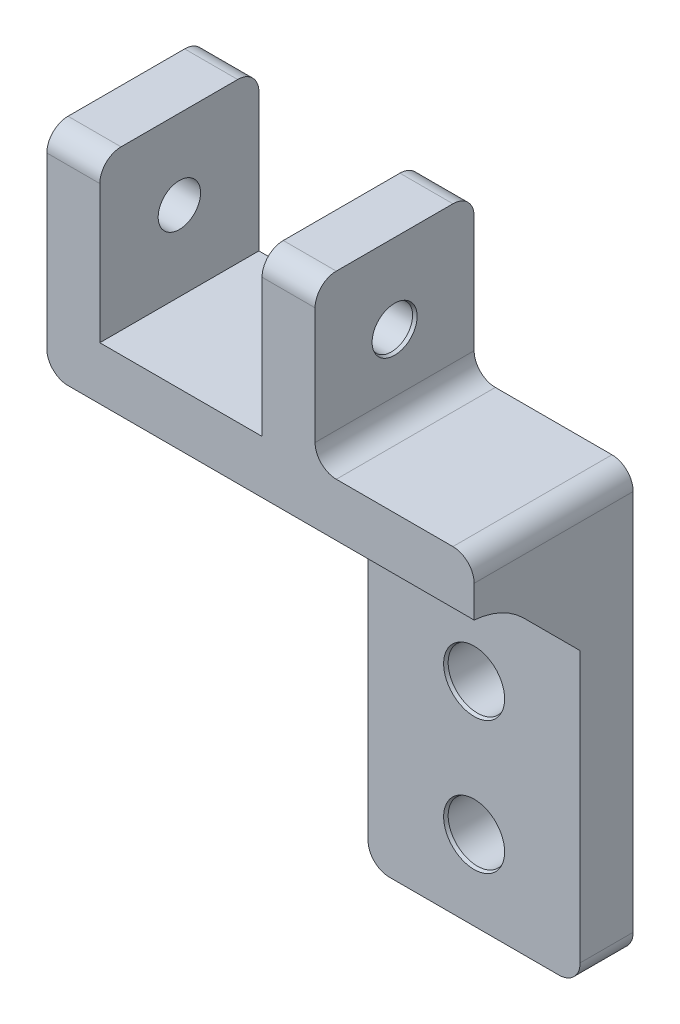
ISO-10303-21;
HEADER;
FILE_DESCRIPTION(('STEP AP214'),'2;1');
FILE_NAME('part.step','',(''),(''),'','','');
FILE_SCHEMA(('AUTOMOTIVE_DESIGN { 1 0 10303 214 1 1 1 1 }'));
ENDSEC;
DATA;
#1=APPLICATION_CONTEXT('core data for automotive mechanical design processes');
#2=APPLICATION_PROTOCOL_DEFINITION('international standard','automotive_design',2000,#1);
#3=PRODUCT_CONTEXT('',#1,'mechanical');
#4=PRODUCT('Part','Part','',(#3));
#5=PRODUCT_RELATED_PRODUCT_CATEGORY('part','',(#4));
#6=PRODUCT_DEFINITION_FORMATION('','',#4);
#7=PRODUCT_DEFINITION_CONTEXT('part definition',#1,'design');
#8=PRODUCT_DEFINITION('design','',#6,#7);
#9=PRODUCT_DEFINITION_SHAPE('','',#8);
#10=(LENGTH_UNIT() NAMED_UNIT(*) SI_UNIT(.MILLI.,.METRE.));
#11=(NAMED_UNIT(*) PLANE_ANGLE_UNIT() SI_UNIT($,.RADIAN.));
#12=(NAMED_UNIT(*) SI_UNIT($,.STERADIAN.) SOLID_ANGLE_UNIT());
#13=UNCERTAINTY_MEASURE_WITH_UNIT(LENGTH_MEASURE(1.E-05),#10,'distance_accuracy_value','');
#14=(GEOMETRIC_REPRESENTATION_CONTEXT(3) GLOBAL_UNCERTAINTY_ASSIGNED_CONTEXT((#13)) GLOBAL_UNIT_ASSIGNED_CONTEXT((#10,
#11,#12)) REPRESENTATION_CONTEXT('',''));
#15=CARTESIAN_POINT('',(0.,0.,0.));
#16=DIRECTION('',(0.,0.,1.));
#17=DIRECTION('',(1.,0.,0.));
#18=AXIS2_PLACEMENT_3D('',#15,#16,#17);
#19=CARTESIAN_POINT('',(5.,35.,0.));
#20=DIRECTION('',(-1.,0.,0.));
#21=DIRECTION('',(0.,0.,1.));
#22=AXIS2_PLACEMENT_3D('',#19,#20,#21);
#23=PLANE('',#22);
#24=DIRECTION('',(0.,-1.,0.));
#25=VECTOR('',#24,1.);
#26=CARTESIAN_POINT('',(5.,35.,10.));
#27=LINE('',#26,#25);
#28=CARTESIAN_POINT('',(5.,33.,10.));
#29=VERTEX_POINT('',#28);
#30=CARTESIAN_POINT('',(5.,22.,10.));
#31=VERTEX_POINT('',#30);
#32=EDGE_CURVE('E234',#29,#31,#27,.T.);
#33=ORIENTED_EDGE('',*,*,#32,.T.);
#34=DIRECTION('',(0.,0.,-1.));
#35=VECTOR('',#34,1.);
#36=CARTESIAN_POINT('',(5.,22.,-4.99999999999999));
#37=LINE('',#36,#35);
#38=CARTESIAN_POINT('',(5.,22.,-4.99999999999999));
#39=VERTEX_POINT('',#38);
#40=EDGE_CURVE('E464',#31,#39,#37,.T.);
#41=ORIENTED_EDGE('',*,*,#40,.T.);
#42=DIRECTION('',(0.,-1.,0.));
#43=VECTOR('',#42,1.);
#44=CARTESIAN_POINT('',(5.,35.,-4.99999999999999));
#45=LINE('',#44,#43);
#46=CARTESIAN_POINT('',(5.,33.,-4.99999999999999));
#47=VERTEX_POINT('',#46);
#48=EDGE_CURVE('E450',#47,#39,#45,.T.);
#49=ORIENTED_EDGE('',*,*,#48,.F.);
#50=CARTESIAN_POINT('',(5.,33.,-2.99999999999999));
#51=DIRECTION('',(-1.,0.,0.));
#52=DIRECTION('',(0.,0.,1.));
#53=AXIS2_PLACEMENT_3D('',#50,#51,#52);
#54=CIRCLE('',#53,2.);
#55=CARTESIAN_POINT('',(5.,35.,-2.99999999999999));
#56=VERTEX_POINT('',#55);
#57=EDGE_CURVE('E559',#47,#56,#54,.F.);
#58=ORIENTED_EDGE('',*,*,#57,.T.);
#59=DIRECTION('',(0.,0.,-1.));
#60=VECTOR('',#59,1.);
#61=CARTESIAN_POINT('',(5.,35.,0.));
#62=LINE('',#61,#60);
#63=CARTESIAN_POINT('',(5.,35.,8.00000000000002));
#64=VERTEX_POINT('',#63);
#65=EDGE_CURVE('E530',#64,#56,#62,.T.);
#66=ORIENTED_EDGE('',*,*,#65,.F.);
#67=CARTESIAN_POINT('',(5.,33.,8.00000000000002));
#68=DIRECTION('',(-1.,0.,0.));
#69=DIRECTION('',(0.,0.,1.));
#70=AXIS2_PLACEMENT_3D('',#67,#68,#69);
#71=CIRCLE('',#70,2.);
#72=EDGE_CURVE('E282',#64,#29,#71,.F.);
#73=ORIENTED_EDGE('',*,*,#72,.T.);
#74=EDGE_LOOP('',(#33,#41,#49,#58,#66,#73));
#75=FACE_BOUND('',#74,.T.);
#76=CARTESIAN_POINT('',(5.00000000000001,27.5,2.50000000000001));
#77=DIRECTION('',(1.,0.,0.));
#78=DIRECTION('',(0.,0.,-1.));
#79=AXIS2_PLACEMENT_3D('',#76,#77,#78);
#80=CIRCLE('',#79,2.125);
#81=CARTESIAN_POINT('',(5.00000000000001,27.5,0.375000000000006));
#82=VERTEX_POINT('',#81);
#83=EDGE_CURVE('E581',#82,#82,#80,.T.);
#84=ORIENTED_EDGE('',*,*,#83,.F.);
#85=EDGE_LOOP('',(#84));
#86=FACE_BOUND('',#85,.T.);
#87=ADVANCED_FACE('F45',(#75,#86),#23,.F.);
#88=CARTESIAN_POINT('',(-20.3,0.,0.));
#89=DIRECTION('',(1.,0.,0.));
#90=DIRECTION('',(0.,0.,-1.));
#91=AXIS2_PLACEMENT_3D('',#88,#89,#90);
#92=PLANE('',#91);
#93=DIRECTION('',(0.,1.,0.));
#94=VECTOR('',#93,1.);
#95=CARTESIAN_POINT('',(-20.3,15.,-4.99999999999999));
#96=LINE('',#95,#94);
#97=CARTESIAN_POINT('',(-20.3,17.,-4.99999999999999));
#98=VERTEX_POINT('',#97);
#99=CARTESIAN_POINT('',(-20.3,33.,-4.99999999999999));
#100=VERTEX_POINT('',#99);
#101=EDGE_CURVE('E484',#98,#100,#96,.T.);
#102=ORIENTED_EDGE('',*,*,#101,.F.);
#103=DIRECTION('',(0.,0.,-1.));
#104=VECTOR('',#103,1.);
#105=CARTESIAN_POINT('',(-20.3,17.,0.));
#106=LINE('',#105,#104);
#107=CARTESIAN_POINT('',(-20.3,17.,10.));
#108=VERTEX_POINT('',#107);
#109=EDGE_CURVE('E417',#98,#108,#106,.F.);
#110=ORIENTED_EDGE('',*,*,#109,.T.);
#111=DIRECTION('',(0.,-1.,0.));
#112=VECTOR('',#111,1.);
#113=CARTESIAN_POINT('',(-20.3,20.,10.));
#114=LINE('',#113,#112);
#115=CARTESIAN_POINT('',(-20.3,33.,10.));
#116=VERTEX_POINT('',#115);
#117=EDGE_CURVE('E223',#116,#108,#114,.T.);
#118=ORIENTED_EDGE('',*,*,#117,.F.);
#119=CARTESIAN_POINT('',(-20.3,33.,8.00000000000002));
#120=DIRECTION('',(1.,0.,0.));
#121=DIRECTION('',(0.,0.,-1.));
#122=AXIS2_PLACEMENT_3D('',#119,#120,#121);
#123=CIRCLE('',#122,2.);
#124=CARTESIAN_POINT('',(-20.3,35.,8.00000000000002));
#125=VERTEX_POINT('',#124);
#126=EDGE_CURVE('E408',#116,#125,#123,.F.);
#127=ORIENTED_EDGE('',*,*,#126,.T.);
#128=DIRECTION('',(0.,0.,1.));
#129=VECTOR('',#128,1.);
#130=CARTESIAN_POINT('',(-20.3,35.,0.));
#131=LINE('',#130,#129);
#132=CARTESIAN_POINT('',(-20.3,35.,-2.99999999999999));
#133=VERTEX_POINT('',#132);
#134=EDGE_CURVE('E544',#133,#125,#131,.T.);
#135=ORIENTED_EDGE('',*,*,#134,.F.);
#136=CARTESIAN_POINT('',(-20.3,33.,-2.99999999999999));
#137=DIRECTION('',(1.,0.,0.));
#138=DIRECTION('',(0.,0.,-1.));
#139=AXIS2_PLACEMENT_3D('',#136,#137,#138);
#140=CIRCLE('',#139,2.);
#141=EDGE_CURVE('E411',#133,#100,#140,.F.);
#142=ORIENTED_EDGE('',*,*,#141,.T.);
#143=EDGE_LOOP('',(#102,#110,#118,#127,#135,#142));
#144=FACE_BOUND('',#143,.T.);
#145=CARTESIAN_POINT('',(-20.3,27.5,2.50000000000001));
#146=DIRECTION('',(-1.,0.,0.));
#147=DIRECTION('',(0.,0.,1.));
#148=AXIS2_PLACEMENT_3D('',#145,#146,#147);
#149=CIRCLE('',#148,2.125);
#150=CARTESIAN_POINT('',(-20.3,27.5,4.62500000000001));
#151=VERTEX_POINT('',#150);
#152=EDGE_CURVE('E574',#151,#151,#149,.T.);
#153=ORIENTED_EDGE('',*,*,#152,.F.);
#154=EDGE_LOOP('',(#153));
#155=FACE_BOUND('',#154,.T.);
#156=ADVANCED_FACE('F355',(#144,#155),#92,.F.);
#157=CARTESIAN_POINT('',(20.,0.,0.));
#158=DIRECTION('',(0.,0.,-1.));
#159=DIRECTION('',(0.,1.,0.));
#160=AXIS2_PLACEMENT_3D('',#157,#158,#159);
#161=PLANE('',#160);
#162=DIRECTION('',(0.,-1.,0.));
#163=VECTOR('',#162,1.);
#164=CARTESIAN_POINT('',(0.,0.,0.));
#165=LINE('',#164,#163);
#166=CARTESIAN_POINT('',(0.,7.49999999999994,0.));
#167=VERTEX_POINT('',#166);
#168=CARTESIAN_POINT('',(0.,-18.,0.));
#169=VERTEX_POINT('',#168);
#170=EDGE_CURVE('E491',#167,#169,#165,.T.);
#171=ORIENTED_EDGE('',*,*,#170,.T.);
#172=CARTESIAN_POINT('',(2.,-18.,0.));
#173=DIRECTION('',(0.,0.,-1.));
#174=DIRECTION('',(0.,1.,0.));
#175=AXIS2_PLACEMENT_3D('',#172,#173,#174);
#176=CIRCLE('',#175,2.);
#177=CARTESIAN_POINT('',(2.,-20.,0.));
#178=VERTEX_POINT('',#177);
#179=EDGE_CURVE('E424',#169,#178,#176,.F.);
#180=ORIENTED_EDGE('',*,*,#179,.T.);
#181=DIRECTION('',(-1.,0.,0.));
#182=VECTOR('',#181,1.);
#183=CARTESIAN_POINT('',(20.,-20.,0.));
#184=LINE('',#183,#182);
#185=CARTESIAN_POINT('',(18.,-20.,0.));
#186=VERTEX_POINT('',#185);
#187=EDGE_CURVE('E252',#186,#178,#184,.T.);
#188=ORIENTED_EDGE('',*,*,#187,.F.);
#189=CARTESIAN_POINT('',(18.,-18.,0.));
#190=DIRECTION('',(0.,0.,-1.));
#191=DIRECTION('',(0.,1.,0.));
#192=AXIS2_PLACEMENT_3D('',#189,#190,#191);
#193=CIRCLE('',#192,2.);
#194=CARTESIAN_POINT('',(20.,-18.,0.));
#195=VERTEX_POINT('',#194);
#196=EDGE_CURVE('E422',#186,#195,#193,.F.);
#197=ORIENTED_EDGE('',*,*,#196,.T.);
#198=DIRECTION('',(0.,-1.,0.));
#199=VECTOR('',#198,1.);
#200=CARTESIAN_POINT('',(20.,0.,0.));
#201=LINE('',#200,#199);
#202=CARTESIAN_POINT('',(20.,7.49999999999994,0.));
#203=VERTEX_POINT('',#202);
#204=EDGE_CURVE('E498',#203,#195,#201,.T.);
#205=ORIENTED_EDGE('',*,*,#204,.F.);
#206=DIRECTION('',(-1.,0.,0.));
#207=VECTOR('',#206,1.);
#208=CARTESIAN_POINT('',(0.,7.49999999999994,0.));
#209=LINE('',#208,#207);
#210=EDGE_CURVE('E259',#203,#167,#209,.T.);
#211=ORIENTED_EDGE('',*,*,#210,.T.);
#212=EDGE_LOOP('',(#171,#180,#188,#197,#205,#211));
#213=FACE_BOUND('',#212,.T.);
#214=CARTESIAN_POINT('',(10.,-12.5,0.));
#215=DIRECTION('',(0.,0.,1.));
#216=DIRECTION('',(1.,0.,0.));
#217=AXIS2_PLACEMENT_3D('',#214,#215,#216);
#218=CIRCLE('',#217,2.875);
#219=CARTESIAN_POINT('',(12.875,-12.5,0.));
#220=VERTEX_POINT('',#219);
#221=EDGE_CURVE('E538',#220,#220,#218,.T.);
#222=ORIENTED_EDGE('',*,*,#221,.F.);
#223=EDGE_LOOP('',(#222));
#224=FACE_BOUND('',#223,.T.);
#225=CARTESIAN_POINT('',(10.,0.,0.));
#226=DIRECTION('',(0.,0.,1.));
#227=DIRECTION('',(1.,0.,0.));
#228=AXIS2_PLACEMENT_3D('',#225,#226,#227);
#229=CIRCLE('',#228,2.875);
#230=CARTESIAN_POINT('',(12.875,0.,0.));
#231=VERTEX_POINT('',#230);
#232=EDGE_CURVE('E590',#231,#231,#229,.T.);
#233=ORIENTED_EDGE('',*,*,#232,.F.);
#234=EDGE_LOOP('',(#233));
#235=FACE_BOUND('',#234,.T.);
#236=ADVANCED_FACE('F362',(#213,#224,#235),#161,.F.);
#237=CARTESIAN_POINT('',(20.,20.,0.));
#238=DIRECTION('',(0.,-1.,0.));
#239=DIRECTION('',(0.,0.,-1.));
#240=AXIS2_PLACEMENT_3D('',#237,#238,#239);
#241=PLANE('',#240);
#242=DIRECTION('',(-1.,0.,0.));
#243=VECTOR('',#242,1.);
#244=CARTESIAN_POINT('',(20.,20.,-4.99999999999999));
#245=LINE('',#244,#243);
#246=CARTESIAN_POINT('',(0.,20.,-4.99999999999999));
#247=VERTEX_POINT('',#246);
#248=CARTESIAN_POINT('',(-15.3,20.,-4.99999999999999));
#249=VERTEX_POINT('',#248);
#250=EDGE_CURVE('E217',#247,#249,#245,.T.);
#251=ORIENTED_EDGE('',*,*,#250,.T.);
#252=DIRECTION('',(0.,0.,1.));
#253=VECTOR('',#252,1.);
#254=CARTESIAN_POINT('',(-15.3,20.,0.));
#255=LINE('',#254,#253);
#256=CARTESIAN_POINT('',(-15.3,20.,10.));
#257=VERTEX_POINT('',#256);
#258=EDGE_CURVE('E227',#249,#257,#255,.T.);
#259=ORIENTED_EDGE('',*,*,#258,.T.);
#260=DIRECTION('',(-1.,0.,0.));
#261=VECTOR('',#260,1.);
#262=CARTESIAN_POINT('',(20.,20.,10.));
#263=LINE('',#262,#261);
#264=CARTESIAN_POINT('',(0.,20.,10.));
#265=VERTEX_POINT('',#264);
#266=EDGE_CURVE('E246',#265,#257,#263,.T.);
#267=ORIENTED_EDGE('',*,*,#266,.F.);
#268=DIRECTION('',(0.,0.,1.));
#269=VECTOR('',#268,1.);
#270=CARTESIAN_POINT('',(0.,20.,0.));
#271=LINE('',#270,#269);
#272=EDGE_CURVE('E239',#247,#265,#271,.T.);
#273=ORIENTED_EDGE('',*,*,#272,.F.);
#274=EDGE_LOOP('',(#251,#259,#267,#273));
#275=FACE_BOUND('',#274,.T.);
#276=ADVANCED_FACE('F237',(#275),#241,.F.);
#277=CARTESIAN_POINT('',(18.,20.,-4.99999999999999));
#278=VERTEX_POINT('',#277);
#279=CARTESIAN_POINT('',(7.,20.,-4.99999999999999));
#280=VERTEX_POINT('',#279);
#281=EDGE_CURVE('E240',#278,#280,#245,.T.);
#282=ORIENTED_EDGE('',*,*,#281,.T.);
#283=DIRECTION('',(0.,0.,-1.));
#284=VECTOR('',#283,1.);
#285=CARTESIAN_POINT('',(7.,20.,10.));
#286=LINE('',#285,#284);
#287=CARTESIAN_POINT('',(7.,20.,10.));
#288=VERTEX_POINT('',#287);
#289=EDGE_CURVE('E456',#280,#288,#286,.F.);
#290=ORIENTED_EDGE('',*,*,#289,.T.);
#291=CARTESIAN_POINT('',(18.,20.,10.));
#292=VERTEX_POINT('',#291);
#293=EDGE_CURVE('E241',#292,#288,#263,.T.);
#294=ORIENTED_EDGE('',*,*,#293,.F.);
#295=DIRECTION('',(0.,0.,1.));
#296=VECTOR('',#295,1.);
#297=CARTESIAN_POINT('',(18.,20.,-4.99999999999999));
#298=LINE('',#297,#296);
#299=EDGE_CURVE('E458',#292,#278,#298,.F.);
#300=ORIENTED_EDGE('',*,*,#299,.T.);
#301=EDGE_LOOP('',(#282,#290,#294,#300));
#302=FACE_BOUND('',#301,.T.);
#303=ADVANCED_FACE('F379',(#302),#241,.F.);
#304=CARTESIAN_POINT('',(20.,0.,9.99999999999999));
#305=DIRECTION('',(0.,0.,-1.));
#306=DIRECTION('',(0.,1.,0.));
#307=AXIS2_PLACEMENT_3D('',#304,#305,#306);
#308=PLANE('',#307);
#309=DIRECTION('',(0.,-1.,0.));
#310=VECTOR('',#309,1.);
#311=CARTESIAN_POINT('',(20.,0.,9.99999999999999));
#312=LINE('',#311,#310);
#313=CARTESIAN_POINT('',(20.,18.,10.));
#314=VERTEX_POINT('',#313);
#315=CARTESIAN_POINT('',(20.,15.,10.));
#316=VERTEX_POINT('',#315);
#317=EDGE_CURVE('E496',#314,#316,#312,.T.);
#318=ORIENTED_EDGE('',*,*,#317,.F.);
#319=CARTESIAN_POINT('',(18.,18.,10.));
#320=DIRECTION('',(0.,0.,-1.));
#321=DIRECTION('',(0.,1.,0.));
#322=AXIS2_PLACEMENT_3D('',#319,#320,#321);
#323=CIRCLE('',#322,2.);
#324=EDGE_CURVE('E475',#314,#292,#323,.F.);
#325=ORIENTED_EDGE('',*,*,#324,.T.);
#326=ORIENTED_EDGE('',*,*,#293,.T.);
#327=CARTESIAN_POINT('',(7.,22.,10.));
#328=DIRECTION('',(0.,0.,-1.));
#329=DIRECTION('',(0.,1.,0.));
#330=AXIS2_PLACEMENT_3D('',#327,#328,#329);
#331=CIRCLE('',#330,2.);
#332=EDGE_CURVE('E11',#288,#31,#331,.T.);
#333=ORIENTED_EDGE('',*,*,#332,.T.);
#334=ORIENTED_EDGE('',*,*,#32,.F.);
#335=DIRECTION('',(1.,0.,0.));
#336=VECTOR('',#335,1.);
#337=CARTESIAN_POINT('',(0.,33.,10.));
#338=LINE('',#337,#336);
#339=CARTESIAN_POINT('',(0.,33.,10.));
#340=VERTEX_POINT('',#339);
#341=EDGE_CURVE('E470',#29,#340,#338,.F.);
#342=ORIENTED_EDGE('',*,*,#341,.T.);
#343=DIRECTION('',(0.,-1.,0.));
#344=VECTOR('',#343,1.);
#345=CARTESIAN_POINT('',(0.,35.,10.));
#346=LINE('',#345,#344);
#347=EDGE_CURVE('E551',#340,#265,#346,.T.);
#348=ORIENTED_EDGE('',*,*,#347,.T.);
#349=ORIENTED_EDGE('',*,*,#266,.T.);
#350=DIRECTION('',(0.,-1.,0.));
#351=VECTOR('',#350,1.);
#352=CARTESIAN_POINT('',(-15.3,35.,10.));
#353=LINE('',#352,#351);
#354=CARTESIAN_POINT('',(-15.3,33.,10.));
#355=VERTEX_POINT('',#354);
#356=EDGE_CURVE('E224',#355,#257,#353,.T.);
#357=ORIENTED_EDGE('',*,*,#356,.F.);
#358=DIRECTION('',(1.,0.,0.));
#359=VECTOR('',#358,1.);
#360=CARTESIAN_POINT('',(-20.3,33.,10.));
#361=LINE('',#360,#359);
#362=EDGE_CURVE('E472',#355,#116,#361,.F.);
#363=ORIENTED_EDGE('',*,*,#362,.T.);
#364=ORIENTED_EDGE('',*,*,#117,.T.);
#365=CARTESIAN_POINT('',(-18.3,17.,10.));
#366=DIRECTION('',(0.,0.,-1.));
#367=DIRECTION('',(0.,1.,0.));
#368=AXIS2_PLACEMENT_3D('',#365,#366,#367);
#369=CIRCLE('',#368,2.);
#370=CARTESIAN_POINT('',(-18.3,15.,10.));
#371=VERTEX_POINT('',#370);
#372=EDGE_CURVE('E406',#108,#371,#369,.F.);
#373=ORIENTED_EDGE('',*,*,#372,.T.);
#374=DIRECTION('',(-1.,0.,0.));
#375=VECTOR('',#374,1.);
#376=CARTESIAN_POINT('',(20.,15.,10.));
#377=LINE('',#376,#375);
#378=CARTESIAN_POINT('',(-7.5,15.,10.));
#379=VERTEX_POINT('',#378);
#380=EDGE_CURVE('E255',#379,#371,#377,.T.);
#381=ORIENTED_EDGE('',*,*,#380,.F.);
#382=EDGE_CURVE('E256',#316,#379,#377,.T.);
#383=ORIENTED_EDGE('',*,*,#382,.F.);
#384=EDGE_LOOP('',(#318,#325,#326,#333,#334,#342,#348,#349,#357,#363,#364,#373,#381,#383));
#385=FACE_BOUND('',#384,.T.);
#386=ADVANCED_FACE('F306',(#385),#308,.F.);
#387=CARTESIAN_POINT('',(20.,15.,0.));
#388=DIRECTION('',(0.,1.,0.));
#389=DIRECTION('',(0.,0.,1.));
#390=AXIS2_PLACEMENT_3D('',#387,#388,#389);
#391=PLANE('',#390);
#392=ORIENTED_EDGE('',*,*,#380,.T.);
#393=DIRECTION('',(0.,0.,-1.));
#394=VECTOR('',#393,1.);
#395=CARTESIAN_POINT('',(-18.3,15.,0.));
#396=LINE('',#395,#394);
#397=CARTESIAN_POINT('',(-18.3,15.,-4.99999999999999));
#398=VERTEX_POINT('',#397);
#399=EDGE_CURVE('E400',#371,#398,#396,.T.);
#400=ORIENTED_EDGE('',*,*,#399,.T.);
#401=DIRECTION('',(1.,0.,0.));
#402=VECTOR('',#401,1.);
#403=CARTESIAN_POINT('',(-20.3,15.,-4.99999999999999));
#404=LINE('',#403,#402);
#405=CARTESIAN_POINT('',(-7.5,15.,-4.99999999999999));
#406=VERTEX_POINT('',#405);
#407=EDGE_CURVE('E485',#398,#406,#404,.T.);
#408=ORIENTED_EDGE('',*,*,#407,.T.);
#409=DIRECTION('',(0.,0.,-1.));
#410=VECTOR('',#409,1.);
#411=CARTESIAN_POINT('',(-7.5,15.,7.49999999999998));
#412=LINE('',#411,#410);
#413=EDGE_CURVE('E267',#406,#379,#412,.F.);
#414=ORIENTED_EDGE('',*,*,#413,.T.);
#415=EDGE_LOOP('',(#392,#400,#408,#414));
#416=FACE_BOUND('',#415,.T.);
#417=ADVANCED_FACE('F386',(#416),#391,.F.);
#418=CARTESIAN_POINT('',(20.,-20.,0.));
#419=DIRECTION('',(0.,-1.,0.));
#420=DIRECTION('',(0.,0.,-1.));
#421=AXIS2_PLACEMENT_3D('',#418,#419,#420);
#422=PLANE('',#421);
#423=ORIENTED_EDGE('',*,*,#187,.T.);
#424=DIRECTION('',(0.,0.,1.));
#425=VECTOR('',#424,1.);
#426=CARTESIAN_POINT('',(2.,-20.,-4.99999999999999));
#427=LINE('',#426,#425);
#428=CARTESIAN_POINT('',(2.,-20.,-4.99999999999999));
#429=VERTEX_POINT('',#428);
#430=EDGE_CURVE('E429',#178,#429,#427,.F.);
#431=ORIENTED_EDGE('',*,*,#430,.T.);
#432=DIRECTION('',(-1.,0.,0.));
#433=VECTOR('',#432,1.);
#434=CARTESIAN_POINT('',(20.,-20.,-4.99999999999999));
#435=LINE('',#434,#433);
#436=CARTESIAN_POINT('',(18.,-20.,-4.99999999999999));
#437=VERTEX_POINT('',#436);
#438=EDGE_CURVE('E244',#437,#429,#435,.T.);
#439=ORIENTED_EDGE('',*,*,#438,.F.);
#440=DIRECTION('',(0.,0.,1.));
#441=VECTOR('',#440,1.);
#442=CARTESIAN_POINT('',(18.,-20.,0.));
#443=LINE('',#442,#441);
#444=EDGE_CURVE('E426',#437,#186,#443,.T.);
#445=ORIENTED_EDGE('',*,*,#444,.T.);
#446=EDGE_LOOP('',(#423,#431,#439,#445));
#447=FACE_BOUND('',#446,.T.);
#448=ADVANCED_FACE('F382',(#447),#422,.T.);
#449=CARTESIAN_POINT('',(20.,0.,-4.99999999999999));
#450=DIRECTION('',(0.,0.,-1.));
#451=DIRECTION('',(-1.,0.,0.));
#452=AXIS2_PLACEMENT_3D('',#449,#450,#451);
#453=PLANE('',#452);
#454=CARTESIAN_POINT('',(10.,0.,-4.99999999999999));
#455=DIRECTION('',(0.,0.,-1.));
#456=DIRECTION('',(-1.,0.,0.));
#457=AXIS2_PLACEMENT_3D('',#454,#455,#456);
#458=CIRCLE('',#457,2.75);
#459=CARTESIAN_POINT('',(7.25,0.,-4.99999999999999));
#460=VERTEX_POINT('',#459);
#461=EDGE_CURVE('E596',#460,#460,#458,.T.);
#462=ORIENTED_EDGE('',*,*,#461,.F.);
#463=EDGE_LOOP('',(#462));
#464=FACE_BOUND('',#463,.T.);
#465=CARTESIAN_POINT('',(10.,-12.5,-4.99999999999999));
#466=DIRECTION('',(0.,0.,-1.));
#467=DIRECTION('',(-1.,0.,0.));
#468=AXIS2_PLACEMENT_3D('',#465,#466,#467);
#469=CIRCLE('',#468,2.75);
#470=CARTESIAN_POINT('',(7.25,-12.5,-4.99999999999999));
#471=VERTEX_POINT('',#470);
#472=EDGE_CURVE('E529',#471,#471,#469,.T.);
#473=ORIENTED_EDGE('',*,*,#472,.F.);
#474=EDGE_LOOP('',(#473));
#475=FACE_BOUND('',#474,.T.);
#476=ORIENTED_EDGE('',*,*,#281,.F.);
#477=CARTESIAN_POINT('',(18.,18.,-4.99999999999999));
#478=DIRECTION('',(0.,0.,-1.));
#479=DIRECTION('',(-1.,0.,0.));
#480=AXIS2_PLACEMENT_3D('',#477,#478,#479);
#481=CIRCLE('',#480,2.);
#482=CARTESIAN_POINT('',(20.,18.,-4.99999999999999));
#483=VERTEX_POINT('',#482);
#484=EDGE_CURVE('E409',#278,#483,#481,.T.);
#485=ORIENTED_EDGE('',*,*,#484,.T.);
#486=DIRECTION('',(0.,-1.,0.));
#487=VECTOR('',#486,1.);
#488=CARTESIAN_POINT('',(20.,0.,-4.99999999999999));
#489=LINE('',#488,#487);
#490=CARTESIAN_POINT('',(20.,-18.,-4.99999999999999));
#491=VERTEX_POINT('',#490);
#492=EDGE_CURVE('E502',#483,#491,#489,.T.);
#493=ORIENTED_EDGE('',*,*,#492,.T.);
#494=CARTESIAN_POINT('',(18.,-18.,-4.99999999999999));
#495=DIRECTION('',(0.,0.,-1.));
#496=DIRECTION('',(-1.,0.,0.));
#497=AXIS2_PLACEMENT_3D('',#494,#495,#496);
#498=CIRCLE('',#497,2.);
#499=EDGE_CURVE('E480',#491,#437,#498,.T.);
#500=ORIENTED_EDGE('',*,*,#499,.T.);
#501=ORIENTED_EDGE('',*,*,#438,.T.);
#502=CARTESIAN_POINT('',(2.,-18.,-4.99999999999999));
#503=DIRECTION('',(0.,0.,-1.));
#504=DIRECTION('',(-1.,0.,0.));
#505=AXIS2_PLACEMENT_3D('',#502,#503,#504);
#506=CIRCLE('',#505,2.);
#507=CARTESIAN_POINT('',(0.,-18.,-4.99999999999999));
#508=VERTEX_POINT('',#507);
#509=EDGE_CURVE('E482',#429,#508,#506,.T.);
#510=ORIENTED_EDGE('',*,*,#509,.T.);
#511=DIRECTION('',(0.,-1.,0.));
#512=VECTOR('',#511,1.);
#513=CARTESIAN_POINT('',(0.,0.,-4.99999999999999));
#514=LINE('',#513,#512);
#515=CARTESIAN_POINT('',(0.,7.5,-4.99999999999999));
#516=VERTEX_POINT('',#515);
#517=EDGE_CURVE('E499',#516,#508,#514,.T.);
#518=ORIENTED_EDGE('',*,*,#517,.F.);
#519=CARTESIAN_POINT('',(-7.5,7.5,-4.99999999999999));
#520=DIRECTION('',(0.,0.,-1.));
#521=DIRECTION('',(-1.,0.,0.));
#522=AXIS2_PLACEMENT_3D('',#519,#520,#521);
#523=CIRCLE('',#522,7.5);
#524=EDGE_CURVE('E271',#516,#406,#523,.F.);
#525=ORIENTED_EDGE('',*,*,#524,.T.);
#526=ORIENTED_EDGE('',*,*,#407,.F.);
#527=CARTESIAN_POINT('',(-18.3,17.,-4.99999999999999));
#528=DIRECTION('',(0.,0.,-1.));
#529=DIRECTION('',(-1.,0.,0.));
#530=AXIS2_PLACEMENT_3D('',#527,#528,#529);
#531=CIRCLE('',#530,2.);
#532=EDGE_CURVE('E407',#398,#98,#531,.T.);
#533=ORIENTED_EDGE('',*,*,#532,.T.);
#534=ORIENTED_EDGE('',*,*,#101,.T.);
#535=DIRECTION('',(-1.,0.,0.));
#536=VECTOR('',#535,1.);
#537=CARTESIAN_POINT('',(20.,33.,-4.99999999999999));
#538=LINE('',#537,#536);
#539=CARTESIAN_POINT('',(-15.3,33.,-4.99999999999999));
#540=VERTEX_POINT('',#539);
#541=EDGE_CURVE('E220',#100,#540,#538,.F.);
#542=ORIENTED_EDGE('',*,*,#541,.T.);
#543=DIRECTION('',(0.,-1.,0.));
#544=VECTOR('',#543,1.);
#545=CARTESIAN_POINT('',(-15.3,35.,-4.99999999999999));
#546=LINE('',#545,#544);
#547=EDGE_CURVE('E211',#540,#249,#546,.T.);
#548=ORIENTED_EDGE('',*,*,#547,.T.);
#549=ORIENTED_EDGE('',*,*,#250,.F.);
#550=DIRECTION('',(0.,-1.,0.));
#551=VECTOR('',#550,1.);
#552=CARTESIAN_POINT('',(0.,35.,-4.99999999999999));
#553=LINE('',#552,#551);
#554=CARTESIAN_POINT('',(0.,33.,-4.99999999999999));
#555=VERTEX_POINT('',#554);
#556=EDGE_CURVE('E554',#555,#247,#553,.T.);
#557=ORIENTED_EDGE('',*,*,#556,.F.);
#558=DIRECTION('',(-1.,0.,0.));
#559=VECTOR('',#558,1.);
#560=CARTESIAN_POINT('',(20.,33.,-4.99999999999999));
#561=LINE('',#560,#559);
#562=EDGE_CURVE('E477',#555,#47,#561,.F.);
#563=ORIENTED_EDGE('',*,*,#562,.T.);
#564=ORIENTED_EDGE('',*,*,#48,.T.);
#565=CARTESIAN_POINT('',(7.,22.,-4.99999999999999));
#566=DIRECTION('',(0.,0.,-1.));
#567=DIRECTION('',(-1.,0.,0.));
#568=AXIS2_PLACEMENT_3D('',#565,#566,#567);
#569=CIRCLE('',#568,2.);
#570=EDGE_CURVE('E53',#39,#280,#569,.F.);
#571=ORIENTED_EDGE('',*,*,#570,.T.);
#572=EDGE_LOOP('',(#476,#485,#493,#500,#501,#510,#518,#525,#526,#533,#534,#542,#548,#549,#557,
#563,#564,#571));
#573=FACE_BOUND('',#572,.T.);
#574=ADVANCED_FACE('F214',(#464,#475,#573),#453,.T.);
#575=CARTESIAN_POINT('',(20.,0.,0.));
#576=DIRECTION('',(1.,0.,0.));
#577=DIRECTION('',(0.,0.,-1.));
#578=AXIS2_PLACEMENT_3D('',#575,#576,#577);
#579=PLANE('',#578);
#580=ORIENTED_EDGE('',*,*,#492,.F.);
#581=DIRECTION('',(0.,0.,1.));
#582=VECTOR('',#581,1.);
#583=CARTESIAN_POINT('',(20.,18.,10.));
#584=LINE('',#583,#582);
#585=EDGE_CURVE('E462',#483,#314,#584,.T.);
#586=ORIENTED_EDGE('',*,*,#585,.T.);
#587=ORIENTED_EDGE('',*,*,#317,.T.);
#588=CARTESIAN_POINT('',(20.,7.52679385772713,10.6333955755254));
#589=DIRECTION('',(1.,0.,0.));
#590=DIRECTION('',(0.,0.,-1.));
#591=AXIS2_PLACEMENT_3D('',#588,#589,#590);
#592=CIRCLE('',#591,7.5);
#593=CARTESIAN_POINT('',(20.,12.8300947166262,5.33009471662622));
#594=VERTEX_POINT('',#593);
#595=EDGE_CURVE('E276',#316,#594,#592,.F.);
#596=ORIENTED_EDGE('',*,*,#595,.T.);
#597=DIRECTION('',(0.,0.707106781186551,0.707106781186544));
#598=VECTOR('',#597,1.);
#599=CARTESIAN_POINT('',(20.,7.49999999999994,0.));
#600=LINE('',#599,#598);
#601=EDGE_CURVE('E262',#594,#203,#600,.F.);
#602=ORIENTED_EDGE('',*,*,#601,.T.);
#603=ORIENTED_EDGE('',*,*,#204,.T.);
#604=DIRECTION('',(0.,0.,1.));
#605=VECTOR('',#604,1.);
#606=CARTESIAN_POINT('',(20.,-18.,0.));
#607=LINE('',#606,#605);
#608=EDGE_CURVE('E460',#195,#491,#607,.F.);
#609=ORIENTED_EDGE('',*,*,#608,.T.);
#610=EDGE_LOOP('',(#580,#586,#587,#596,#602,#603,#609));
#611=FACE_BOUND('',#610,.T.);
#612=ADVANCED_FACE('F370',(#611),#579,.T.);
#613=CARTESIAN_POINT('',(0.,0.,0.));
#614=DIRECTION('',(1.,0.,0.));
#615=DIRECTION('',(0.,0.,-1.));
#616=AXIS2_PLACEMENT_3D('',#613,#614,#615);
#617=PLANE('',#616);
#618=ORIENTED_EDGE('',*,*,#517,.T.);
#619=DIRECTION('',(0.,0.,1.));
#620=VECTOR('',#619,1.);
#621=CARTESIAN_POINT('',(0.,-18.,0.));
#622=LINE('',#621,#620);
#623=EDGE_CURVE('E419',#508,#169,#622,.T.);
#624=ORIENTED_EDGE('',*,*,#623,.T.);
#625=ORIENTED_EDGE('',*,*,#170,.F.);
#626=DIRECTION('',(0.,0.,-1.));
#627=VECTOR('',#626,1.);
#628=CARTESIAN_POINT('',(0.,7.5,-4.99999999999999));
#629=LINE('',#628,#627);
#630=EDGE_CURVE('E264',#167,#516,#629,.T.);
#631=ORIENTED_EDGE('',*,*,#630,.T.);
#632=EDGE_LOOP('',(#618,#624,#625,#631));
#633=FACE_BOUND('',#632,.T.);
#634=ADVANCED_FACE('F304',(#633),#617,.F.);
#635=CARTESIAN_POINT('',(20.,7.49999999999994,0.));
#636=DIRECTION('',(0.,-0.707106781186544,0.707106781186551));
#637=DIRECTION('',(1.,0.,0.));
#638=AXIS2_PLACEMENT_3D('',#635,#636,#637);
#639=PLANE('',#638);
#640=ORIENTED_EDGE('',*,*,#601,.F.);
#641=DIRECTION('',(1.,0.,0.));
#642=VECTOR('',#641,1.);
#643=CARTESIAN_POINT('',(20.,12.8300947166262,5.33009471662622));
#644=LINE('',#643,#642);
#645=CARTESIAN_POINT('',(0.,12.8300947166262,5.33009471662622));
#646=VERTEX_POINT('',#645);
#647=EDGE_CURVE('E269',#594,#646,#644,.F.);
#648=ORIENTED_EDGE('',*,*,#647,.T.);
#649=CARTESIAN_POINT('',(0.,12.8300947166262,5.33009471662621));
#650=CARTESIAN_POINT('',(-2.22362905854854,12.8300947166262,5.33009471662621));
#651=B_SPLINE_CURVE_WITH_KNOTS('',1,(#649,#650),.UNSPECIFIED.,.F.,.F.,(2,2),(0.,1.),.UNSPECIFIED.);
#652=CARTESIAN_POINT('',(-2.22362905854854,12.8300947166262,5.33009471662622));
#653=VERTEX_POINT('',#652);
#654=EDGE_CURVE('E278',#646,#653,#651,.T.);
#655=ORIENTED_EDGE('',*,*,#654,.T.);
#656=CARTESIAN_POINT('',(-7.5,7.5,0.));
#657=DIRECTION('',(0.,-0.707106781186544,0.707106781186551));
#658=DIRECTION('',(0.,0.707106781186551,0.707106781186544));
#659=AXIS2_PLACEMENT_3D('',#656,#657,#658);
#660=ELLIPSE('',#659,10.6066017177982,7.5);
#661=EDGE_CURVE('E274',#653,#167,#660,.F.);
#662=ORIENTED_EDGE('',*,*,#661,.T.);
#663=ORIENTED_EDGE('',*,*,#210,.F.);
#664=EDGE_LOOP('',(#640,#648,#655,#662,#663));
#665=FACE_BOUND('',#664,.T.);
#666=ADVANCED_FACE('F292',(#665),#639,.T.);
#667=CARTESIAN_POINT('',(0.,35.,0.));
#668=DIRECTION('',(1.,0.,0.));
#669=DIRECTION('',(0.,0.,-1.));
#670=AXIS2_PLACEMENT_3D('',#667,#668,#669);
#671=PLANE('',#670);
#672=CARTESIAN_POINT('',(0.,27.5,2.50000000000001));
#673=DIRECTION('',(1.,0.,0.));
#674=DIRECTION('',(0.,0.,-1.));
#675=AXIS2_PLACEMENT_3D('',#672,#673,#674);
#676=CIRCLE('',#675,2.);
#677=CARTESIAN_POINT('',(0.,27.5,0.500000000000009));
#678=VERTEX_POINT('',#677);
#679=EDGE_CURVE('E572',#678,#678,#676,.T.);
#680=ORIENTED_EDGE('',*,*,#679,.T.);
#681=EDGE_LOOP('',(#680));
#682=FACE_BOUND('',#681,.T.);
#683=DIRECTION('',(0.,0.,1.));
#684=VECTOR('',#683,1.);
#685=CARTESIAN_POINT('',(0.,35.,0.));
#686=LINE('',#685,#684);
#687=CARTESIAN_POINT('',(0.,35.,-2.99999999999999));
#688=VERTEX_POINT('',#687);
#689=CARTESIAN_POINT('',(0.,35.,8.00000000000002));
#690=VERTEX_POINT('',#689);
#691=EDGE_CURVE('E550',#688,#690,#686,.T.);
#692=ORIENTED_EDGE('',*,*,#691,.F.);
#693=CARTESIAN_POINT('',(0.,33.,-2.99999999999999));
#694=DIRECTION('',(1.,0.,0.));
#695=DIRECTION('',(0.,0.,-1.));
#696=AXIS2_PLACEMENT_3D('',#693,#694,#695);
#697=CIRCLE('',#696,2.);
#698=EDGE_CURVE('E68',#688,#555,#697,.F.);
#699=ORIENTED_EDGE('',*,*,#698,.T.);
#700=ORIENTED_EDGE('',*,*,#556,.T.);
#701=ORIENTED_EDGE('',*,*,#272,.T.);
#702=ORIENTED_EDGE('',*,*,#347,.F.);
#703=CARTESIAN_POINT('',(0.,33.,8.00000000000002));
#704=DIRECTION('',(1.,0.,0.));
#705=DIRECTION('',(0.,0.,-1.));
#706=AXIS2_PLACEMENT_3D('',#703,#704,#705);
#707=CIRCLE('',#706,2.);
#708=EDGE_CURVE('E60',#340,#690,#707,.F.);
#709=ORIENTED_EDGE('',*,*,#708,.T.);
#710=EDGE_LOOP('',(#692,#699,#700,#701,#702,#709));
#711=FACE_BOUND('',#710,.T.);
#712=ADVANCED_FACE('F303',(#682,#711),#671,.F.);
#713=CARTESIAN_POINT('',(0.,35.,0.));
#714=DIRECTION('',(0.,1.,0.));
#715=DIRECTION('',(0.,0.,1.));
#716=AXIS2_PLACEMENT_3D('',#713,#714,#715);
#717=PLANE('',#716);
#718=ORIENTED_EDGE('',*,*,#65,.T.);
#719=DIRECTION('',(-1.,0.,0.));
#720=VECTOR('',#719,1.);
#721=CARTESIAN_POINT('',(0.,35.,-2.99999999999999));
#722=LINE('',#721,#720);
#723=EDGE_CURVE('E444',#56,#688,#722,.T.);
#724=ORIENTED_EDGE('',*,*,#723,.T.);
#725=ORIENTED_EDGE('',*,*,#691,.T.);
#726=DIRECTION('',(1.,0.,0.));
#727=VECTOR('',#726,1.);
#728=CARTESIAN_POINT('',(5.,35.,8.00000000000002));
#729=LINE('',#728,#727);
#730=EDGE_CURVE('E441',#690,#64,#729,.T.);
#731=ORIENTED_EDGE('',*,*,#730,.T.);
#732=EDGE_LOOP('',(#718,#724,#725,#731));
#733=FACE_BOUND('',#732,.T.);
#734=ADVANCED_FACE('F562',(#733),#717,.T.);
#735=CARTESIAN_POINT('',(-15.3,35.,0.));
#736=DIRECTION('',(1.,0.,0.));
#737=DIRECTION('',(0.,0.,-1.));
#738=AXIS2_PLACEMENT_3D('',#735,#736,#737);
#739=PLANE('',#738);
#740=CARTESIAN_POINT('',(-15.3,27.5,2.50000000000001));
#741=DIRECTION('',(1.,0.,0.));
#742=DIRECTION('',(0.,0.,-1.));
#743=AXIS2_PLACEMENT_3D('',#740,#741,#742);
#744=CIRCLE('',#743,2.);
#745=CARTESIAN_POINT('',(-15.3,27.5,0.500000000000009));
#746=VERTEX_POINT('',#745);
#747=EDGE_CURVE('E587',#746,#746,#744,.T.);
#748=ORIENTED_EDGE('',*,*,#747,.F.);
#749=EDGE_LOOP('',(#748));
#750=FACE_BOUND('',#749,.T.);
#751=ORIENTED_EDGE('',*,*,#547,.F.);
#752=CARTESIAN_POINT('',(-15.3,33.,-2.99999999999999));
#753=DIRECTION('',(1.,0.,0.));
#754=DIRECTION('',(0.,0.,-1.));
#755=AXIS2_PLACEMENT_3D('',#752,#753,#754);
#756=CIRCLE('',#755,2.);
#757=CARTESIAN_POINT('',(-15.3,35.,-2.99999999999999));
#758=VERTEX_POINT('',#757);
#759=EDGE_CURVE('E439',#540,#758,#756,.T.);
#760=ORIENTED_EDGE('',*,*,#759,.T.);
#761=DIRECTION('',(0.,0.,1.));
#762=VECTOR('',#761,1.);
#763=CARTESIAN_POINT('',(-15.3,35.,0.));
#764=LINE('',#763,#762);
#765=CARTESIAN_POINT('',(-15.3,35.,8.00000000000002));
#766=VERTEX_POINT('',#765);
#767=EDGE_CURVE('E233',#758,#766,#764,.T.);
#768=ORIENTED_EDGE('',*,*,#767,.T.);
#769=CARTESIAN_POINT('',(-15.3,33.,8.00000000000002));
#770=DIRECTION('',(1.,0.,0.));
#771=DIRECTION('',(0.,0.,-1.));
#772=AXIS2_PLACEMENT_3D('',#769,#770,#771);
#773=CIRCLE('',#772,2.);
#774=EDGE_CURVE('E437',#766,#355,#773,.T.);
#775=ORIENTED_EDGE('',*,*,#774,.T.);
#776=ORIENTED_EDGE('',*,*,#356,.T.);
#777=ORIENTED_EDGE('',*,*,#258,.F.);
#778=EDGE_LOOP('',(#751,#760,#768,#775,#776,#777));
#779=FACE_BOUND('',#778,.T.);
#780=ADVANCED_FACE('F228',(#750,#779),#739,.T.);
#781=CARTESIAN_POINT('',(0.,35.,0.));
#782=DIRECTION('',(0.,1.,0.));
#783=DIRECTION('',(0.,0.,1.));
#784=AXIS2_PLACEMENT_3D('',#781,#782,#783);
#785=PLANE('',#784);
#786=ORIENTED_EDGE('',*,*,#767,.F.);
#787=DIRECTION('',(-1.,0.,0.));
#788=VECTOR('',#787,1.);
#789=CARTESIAN_POINT('',(0.,35.,-2.99999999999999));
#790=LINE('',#789,#788);
#791=EDGE_CURVE('E434',#758,#133,#790,.T.);
#792=ORIENTED_EDGE('',*,*,#791,.T.);
#793=ORIENTED_EDGE('',*,*,#134,.T.);
#794=DIRECTION('',(1.,0.,0.));
#795=VECTOR('',#794,1.);
#796=CARTESIAN_POINT('',(-15.3,35.,8.00000000000002));
#797=LINE('',#796,#795);
#798=EDGE_CURVE('E431',#125,#766,#797,.T.);
#799=ORIENTED_EDGE('',*,*,#798,.T.);
#800=EDGE_LOOP('',(#786,#792,#793,#799));
#801=FACE_BOUND('',#800,.T.);
#802=ADVANCED_FACE('F312',(#801),#785,.T.);
#803=CARTESIAN_POINT('',(20.,7.52679385772713,10.6333955755254));
#804=DIRECTION('',(-1.,0.,0.));
#805=DIRECTION('',(0.,0.,1.));
#806=AXIS2_PLACEMENT_3D('',#803,#804,#805);
#807=CYLINDRICAL_SURFACE('',#806,7.5);
#808=ORIENTED_EDGE('',*,*,#595,.F.);
#809=ORIENTED_EDGE('',*,*,#382,.T.);
#810=CARTESIAN_POINT('',(-7.5,15.,10.));
#811=CARTESIAN_POINT('',(-7.45064003588759,15.0000107973634,10.0002495897014));
#812=CARTESIAN_POINT('',(-7.40191431793143,14.9995135715638,9.99421820981718));
#813=CARTESIAN_POINT('',(-7.30773085253212,14.997676100823,9.97305027310254));
#814=CARTESIAN_POINT('',(-7.26222110005871,14.9963580826153,9.9581542257652));
#815=CARTESIAN_POINT('',(-7.16757871367298,14.9928020049232,9.91986796509792));
#816=CARTESIAN_POINT('',(-7.1188440141531,14.9904601868661,9.89557437359284));
#817=CARTESIAN_POINT('',(-7.0238886615845,14.9850228661308,9.84247886455101));
#818=CARTESIAN_POINT('',(-6.9776737473791,14.9819257242934,9.81366719135174));
#819=CARTESIAN_POINT('',(-6.83969897276582,14.9714586993156,9.72193747768542));
#820=CARTESIAN_POINT('',(-6.75084723102007,14.963007456072,9.65485912631661));
#821=CARTESIAN_POINT('',(-6.56527685165301,14.9421824151855,9.50717021184786));
#822=CARTESIAN_POINT('',(-6.46910880927052,14.9294337811206,9.42595340847993));
#823=CARTESIAN_POINT('',(-6.2794431014943,14.9006363972045,9.26099936987607));
#824=CARTESIAN_POINT('',(-6.18594586802747,14.884587116971,9.17726173141432));
#825=CARTESIAN_POINT('',(-5.90765733176657,14.8314545878726,8.92411472131069));
#826=CARTESIAN_POINT('',(-5.72534777309644,14.7894189033355,8.75300941391974));
#827=CARTESIAN_POINT('',(-5.36697986497867,14.6926426083875,8.412666549006));
#828=CARTESIAN_POINT('',(-5.19087136092459,14.6380715841215,8.24343313203368));
#829=CARTESIAN_POINT('',(-4.84219900991675,14.5157127174268,7.90628304818107));
#830=CARTESIAN_POINT('',(-4.66963334343007,14.4479318570339,7.73836573423588));
#831=CARTESIAN_POINT('',(-4.29779889231543,14.285575170016,7.37530733493147));
#832=CARTESIAN_POINT('',(-4.09922168766388,14.1883791956979,7.18061930794135));
#833=CARTESIAN_POINT('',(-3.70790570764852,13.9745453916726,6.79609044583648));
#834=CARTESIAN_POINT('',(-3.5151669853995,13.8579073851569,6.60624965482128));
#835=CARTESIAN_POINT('',(-3.13379982861518,13.6024399949519,6.23010101915647));
#836=CARTESIAN_POINT('',(-2.94528205181498,13.4632934851597,6.0438941447393));
#837=CARTESIAN_POINT('',(-2.66926848393423,13.2383044954665,5.77103384811189));
#838=CARTESIAN_POINT('',(-2.5783475349301,13.1605538314359,5.68111222886496));
#839=CARTESIAN_POINT('',(-2.39902827484833,12.999509086715,5.50370448421718));
#840=CARTESIAN_POINT('',(-2.31063047190959,12.9162139005065,5.41621884948732));
#841=CARTESIAN_POINT('',(-2.22362905854855,12.8300947166262,5.3300947166262));
#842=B_SPLINE_CURVE_WITH_KNOTS('',3,(#810,#811,#812,#813,#814,#815,#816,#817,#818,#819,#820,
#821,#822,#823,#824,#825,#826,#827,#828,#829,#830,#831,#832,#833,#834,#835,#836,#837,#838,#839,
#840,#841),.UNSPECIFIED.,.F.,.F.,(4,2,2,2,2,2,2,2,2,2,2,2,2,2,2,4),(0.,0.146734991609239,
0.289659583362395,0.452798188602042,0.6162940282137,0.950754243188999,1.33022734777384,
1.70976147777259,2.46993142199322,3.22036700060843,3.97040700828396,4.85345935504618,
5.73651973284476,6.63332376154336,7.08217323801467,7.53111247990461),.UNSPECIFIED.);
#843=EDGE_CURVE('E283',#653,#379,#842,.F.);
#844=ORIENTED_EDGE('',*,*,#843,.F.);
#845=ORIENTED_EDGE('',*,*,#654,.F.);
#846=ORIENTED_EDGE('',*,*,#647,.F.);
#847=EDGE_LOOP('',(#808,#809,#844,#845,#846));
#848=FACE_BOUND('',#847,.T.);
#849=ADVANCED_FACE('F308',(#848),#807,.F.);
#850=CARTESIAN_POINT('',(-7.5,7.5,0.));
#851=DIRECTION('',(0.,0.,1.));
#852=DIRECTION('',(1.,0.,0.));
#853=AXIS2_PLACEMENT_3D('',#850,#851,#852);
#854=CYLINDRICAL_SURFACE('',#853,7.5);
#855=ORIENTED_EDGE('',*,*,#843,.T.);
#856=ORIENTED_EDGE('',*,*,#413,.F.);
#857=ORIENTED_EDGE('',*,*,#524,.F.);
#858=ORIENTED_EDGE('',*,*,#630,.F.);
#859=ORIENTED_EDGE('',*,*,#661,.F.);
#860=EDGE_LOOP('',(#855,#856,#857,#858,#859));
#861=FACE_BOUND('',#860,.T.);
#862=ADVANCED_FACE('F311',(#861),#854,.F.);
#863=CARTESIAN_POINT('',(10.,-12.5,0.));
#864=DIRECTION('',(0.,0.,1.));
#865=DIRECTION('',(1.,0.,0.));
#866=AXIS2_PLACEMENT_3D('',#863,#864,#865);
#867=CYLINDRICAL_SURFACE('',#866,2.75);
#868=CARTESIAN_POINT('',(10.,-12.5,-0.30177669529664));
#869=DIRECTION('',(0.,0.,1.));
#870=DIRECTION('',(1.,0.,0.));
#871=AXIS2_PLACEMENT_3D('',#868,#869,#870);
#872=CIRCLE('',#871,2.75);
#873=CARTESIAN_POINT('',(12.75,-12.5,-0.30177669529664));
#874=VERTEX_POINT('',#873);
#875=EDGE_CURVE('E533',#874,#874,#872,.T.);
#876=ORIENTED_EDGE('',*,*,#875,.T.);
#877=EDGE_LOOP('',(#876));
#878=FACE_BOUND('',#877,.T.);
#879=ORIENTED_EDGE('',*,*,#472,.T.);
#880=EDGE_LOOP('',(#879));
#881=FACE_BOUND('',#880,.T.);
#882=ADVANCED_FACE('F317',(#878,#881),#867,.F.);
#883=CARTESIAN_POINT('',(10.,-12.5,0.));
#884=DIRECTION('',(0.,0.,1.));
#885=DIRECTION('',(1.,0.,0.));
#886=AXIS2_PLACEMENT_3D('',#883,#884,#885);
#887=CONICAL_SURFACE('',#886,2.875,0.392699081698726);
#888=ORIENTED_EDGE('',*,*,#875,.F.);
#889=EDGE_LOOP('',(#888));
#890=FACE_BOUND('',#889,.T.);
#891=ORIENTED_EDGE('',*,*,#221,.T.);
#892=EDGE_LOOP('',(#891));
#893=FACE_BOUND('',#892,.T.);
#894=ADVANCED_FACE('F601',(#890,#893),#887,.F.);
#895=CARTESIAN_POINT('',(10.,0.,0.));
#896=DIRECTION('',(0.,0.,1.));
#897=DIRECTION('',(1.,0.,0.));
#898=AXIS2_PLACEMENT_3D('',#895,#896,#897);
#899=CYLINDRICAL_SURFACE('',#898,2.75);
#900=CARTESIAN_POINT('',(10.,0.,-0.30177669529664));
#901=DIRECTION('',(0.,0.,1.));
#902=DIRECTION('',(1.,0.,0.));
#903=AXIS2_PLACEMENT_3D('',#900,#901,#902);
#904=CIRCLE('',#903,2.75);
#905=CARTESIAN_POINT('',(12.75,0.,-0.30177669529664));
#906=VERTEX_POINT('',#905);
#907=EDGE_CURVE('E593',#906,#906,#904,.T.);
#908=ORIENTED_EDGE('',*,*,#907,.T.);
#909=EDGE_LOOP('',(#908));
#910=FACE_BOUND('',#909,.T.);
#911=ORIENTED_EDGE('',*,*,#461,.T.);
#912=EDGE_LOOP('',(#911));
#913=FACE_BOUND('',#912,.T.);
#914=ADVANCED_FACE('F608',(#910,#913),#899,.F.);
#915=CARTESIAN_POINT('',(10.,0.,0.));
#916=DIRECTION('',(0.,0.,1.));
#917=DIRECTION('',(1.,0.,0.));
#918=AXIS2_PLACEMENT_3D('',#915,#916,#917);
#919=CONICAL_SURFACE('',#918,2.875,0.392699081698726);
#920=ORIENTED_EDGE('',*,*,#907,.F.);
#921=EDGE_LOOP('',(#920));
#922=FACE_BOUND('',#921,.T.);
#923=ORIENTED_EDGE('',*,*,#232,.T.);
#924=EDGE_LOOP('',(#923));
#925=FACE_BOUND('',#924,.T.);
#926=ADVANCED_FACE('F605',(#922,#925),#919,.F.);
#927=CARTESIAN_POINT('',(-20.3,27.5,2.50000000000001));
#928=DIRECTION('',(-1.,0.,0.));
#929=DIRECTION('',(0.,0.,1.));
#930=AXIS2_PLACEMENT_3D('',#927,#928,#929);
#931=CYLINDRICAL_SURFACE('',#930,2.);
#932=CARTESIAN_POINT('',(-19.9982233047034,27.5,2.50000000000001));
#933=DIRECTION('',(-1.,0.,0.));
#934=DIRECTION('',(0.,0.,1.));
#935=AXIS2_PLACEMENT_3D('',#932,#933,#934);
#936=CIRCLE('',#935,2.);
#937=CARTESIAN_POINT('',(-19.9982233047034,27.5,4.50000000000001));
#938=VERTEX_POINT('',#937);
#939=EDGE_CURVE('E578',#938,#938,#936,.T.);
#940=ORIENTED_EDGE('',*,*,#939,.T.);
#941=EDGE_LOOP('',(#940));
#942=FACE_BOUND('',#941,.T.);
#943=ORIENTED_EDGE('',*,*,#747,.T.);
#944=EDGE_LOOP('',(#943));
#945=FACE_BOUND('',#944,.T.);
#946=ADVANCED_FACE('F607',(#942,#945),#931,.F.);
#947=CARTESIAN_POINT('',(-20.3,27.5,2.50000000000001));
#948=DIRECTION('',(-1.,0.,0.));
#949=DIRECTION('',(0.,0.,1.));
#950=AXIS2_PLACEMENT_3D('',#947,#948,#949);
#951=CONICAL_SURFACE('',#950,2.125,0.392699081698727);
#952=ORIENTED_EDGE('',*,*,#939,.F.);
#953=EDGE_LOOP('',(#952));
#954=FACE_BOUND('',#953,.T.);
#955=ORIENTED_EDGE('',*,*,#152,.T.);
#956=EDGE_LOOP('',(#955));
#957=FACE_BOUND('',#956,.T.);
#958=ADVANCED_FACE('F615',(#954,#957),#951,.F.);
#959=CARTESIAN_POINT('',(5.,27.5,2.50000000000001));
#960=DIRECTION('',(1.,0.,0.));
#961=DIRECTION('',(0.,0.,-1.));
#962=AXIS2_PLACEMENT_3D('',#959,#960,#961);
#963=CYLINDRICAL_SURFACE('',#962,2.);
#964=ORIENTED_EDGE('',*,*,#679,.F.);
#965=EDGE_LOOP('',(#964));
#966=FACE_BOUND('',#965,.T.);
#967=CARTESIAN_POINT('',(4.69822330470337,27.5,2.50000000000001));
#968=DIRECTION('',(1.,0.,0.));
#969=DIRECTION('',(0.,0.,-1.));
#970=AXIS2_PLACEMENT_3D('',#967,#968,#969);
#971=CIRCLE('',#970,2.);
#972=CARTESIAN_POINT('',(4.69822330470337,27.5,0.500000000000009));
#973=VERTEX_POINT('',#972);
#974=EDGE_CURVE('E575',#973,#973,#971,.T.);
#975=ORIENTED_EDGE('',*,*,#974,.T.);
#976=EDGE_LOOP('',(#975));
#977=FACE_BOUND('',#976,.T.);
#978=ADVANCED_FACE('F705',(#966,#977),#963,.F.);
#979=CARTESIAN_POINT('',(5.00000000000001,27.5,2.50000000000001));
#980=DIRECTION('',(1.,0.,0.));
#981=DIRECTION('',(0.,0.,-1.));
#982=AXIS2_PLACEMENT_3D('',#979,#980,#981);
#983=CONICAL_SURFACE('',#982,2.125,0.392699081698731);
#984=ORIENTED_EDGE('',*,*,#974,.F.);
#985=EDGE_LOOP('',(#984));
#986=FACE_BOUND('',#985,.T.);
#987=ORIENTED_EDGE('',*,*,#83,.T.);
#988=EDGE_LOOP('',(#987));
#989=FACE_BOUND('',#988,.T.);
#990=ADVANCED_FACE('F323',(#986,#989),#983,.F.);
#991=CARTESIAN_POINT('',(7.,22.,0.));
#992=DIRECTION('',(0.,0.,1.));
#993=DIRECTION('',(1.,0.,0.));
#994=AXIS2_PLACEMENT_3D('',#991,#992,#993);
#995=CYLINDRICAL_SURFACE('',#994,2.);
#996=ORIENTED_EDGE('',*,*,#332,.F.);
#997=ORIENTED_EDGE('',*,*,#289,.F.);
#998=ORIENTED_EDGE('',*,*,#570,.F.);
#999=ORIENTED_EDGE('',*,*,#40,.F.);
#1000=EDGE_LOOP('',(#996,#997,#998,#999));
#1001=FACE_BOUND('',#1000,.T.);
#1002=ADVANCED_FACE('F319',(#1001),#995,.F.);
#1003=CARTESIAN_POINT('',(18.,18.,0.));
#1004=DIRECTION('',(0.,0.,-1.));
#1005=DIRECTION('',(-1.,0.,0.));
#1006=AXIS2_PLACEMENT_3D('',#1003,#1004,#1005);
#1007=CYLINDRICAL_SURFACE('',#1006,2.);
#1008=ORIENTED_EDGE('',*,*,#484,.F.);
#1009=ORIENTED_EDGE('',*,*,#299,.F.);
#1010=ORIENTED_EDGE('',*,*,#324,.F.);
#1011=ORIENTED_EDGE('',*,*,#585,.F.);
#1012=EDGE_LOOP('',(#1008,#1009,#1010,#1011));
#1013=FACE_BOUND('',#1012,.T.);
#1014=ADVANCED_FACE('F322',(#1013),#1007,.T.);
#1015=CARTESIAN_POINT('',(-18.3,17.,0.));
#1016=DIRECTION('',(0.,0.,-1.));
#1017=DIRECTION('',(-1.,0.,0.));
#1018=AXIS2_PLACEMENT_3D('',#1015,#1016,#1017);
#1019=CYLINDRICAL_SURFACE('',#1018,2.);
#1020=ORIENTED_EDGE('',*,*,#372,.F.);
#1021=ORIENTED_EDGE('',*,*,#109,.F.);
#1022=ORIENTED_EDGE('',*,*,#532,.F.);
#1023=ORIENTED_EDGE('',*,*,#399,.F.);
#1024=EDGE_LOOP('',(#1020,#1021,#1022,#1023));
#1025=FACE_BOUND('',#1024,.T.);
#1026=ADVANCED_FACE('F327',(#1025),#1019,.T.);
#1027=CARTESIAN_POINT('',(2.,-18.,0.));
#1028=DIRECTION('',(0.,0.,-1.));
#1029=DIRECTION('',(-1.,0.,0.));
#1030=AXIS2_PLACEMENT_3D('',#1027,#1028,#1029);
#1031=CYLINDRICAL_SURFACE('',#1030,2.);
#1032=ORIENTED_EDGE('',*,*,#509,.F.);
#1033=ORIENTED_EDGE('',*,*,#430,.F.);
#1034=ORIENTED_EDGE('',*,*,#179,.F.);
#1035=ORIENTED_EDGE('',*,*,#623,.F.);
#1036=EDGE_LOOP('',(#1032,#1033,#1034,#1035));
#1037=FACE_BOUND('',#1036,.T.);
#1038=ADVANCED_FACE('F331',(#1037),#1031,.T.);
#1039=CARTESIAN_POINT('',(18.,-18.,0.));
#1040=DIRECTION('',(0.,0.,1.));
#1041=DIRECTION('',(1.,0.,0.));
#1042=AXIS2_PLACEMENT_3D('',#1039,#1040,#1041);
#1043=CYLINDRICAL_SURFACE('',#1042,2.);
#1044=ORIENTED_EDGE('',*,*,#499,.F.);
#1045=ORIENTED_EDGE('',*,*,#608,.F.);
#1046=ORIENTED_EDGE('',*,*,#196,.F.);
#1047=ORIENTED_EDGE('',*,*,#444,.F.);
#1048=EDGE_LOOP('',(#1044,#1045,#1046,#1047));
#1049=FACE_BOUND('',#1048,.T.);
#1050=ADVANCED_FACE('F335',(#1049),#1043,.T.);
#1051=CARTESIAN_POINT('',(0.,33.,-2.99999999999999));
#1052=DIRECTION('',(-1.,0.,0.));
#1053=DIRECTION('',(0.,0.,1.));
#1054=AXIS2_PLACEMENT_3D('',#1051,#1052,#1053);
#1055=CYLINDRICAL_SURFACE('',#1054,2.);
#1056=ORIENTED_EDGE('',*,*,#759,.F.);
#1057=ORIENTED_EDGE('',*,*,#541,.F.);
#1058=ORIENTED_EDGE('',*,*,#141,.F.);
#1059=ORIENTED_EDGE('',*,*,#791,.F.);
#1060=EDGE_LOOP('',(#1056,#1057,#1058,#1059));
#1061=FACE_BOUND('',#1060,.T.);
#1062=ADVANCED_FACE('F339',(#1061),#1055,.T.);
#1063=CARTESIAN_POINT('',(0.,33.,8.00000000000002));
#1064=DIRECTION('',(-1.,0.,0.));
#1065=DIRECTION('',(0.,0.,1.));
#1066=AXIS2_PLACEMENT_3D('',#1063,#1064,#1065);
#1067=CYLINDRICAL_SURFACE('',#1066,2.);
#1068=ORIENTED_EDGE('',*,*,#126,.F.);
#1069=ORIENTED_EDGE('',*,*,#362,.F.);
#1070=ORIENTED_EDGE('',*,*,#774,.F.);
#1071=ORIENTED_EDGE('',*,*,#798,.F.);
#1072=EDGE_LOOP('',(#1068,#1069,#1070,#1071));
#1073=FACE_BOUND('',#1072,.T.);
#1074=ADVANCED_FACE('F343',(#1073),#1067,.T.);
#1075=CARTESIAN_POINT('',(0.,33.,-2.99999999999999));
#1076=DIRECTION('',(-1.,0.,0.));
#1077=DIRECTION('',(0.,0.,1.));
#1078=AXIS2_PLACEMENT_3D('',#1075,#1076,#1077);
#1079=CYLINDRICAL_SURFACE('',#1078,2.);
#1080=ORIENTED_EDGE('',*,*,#57,.F.);
#1081=ORIENTED_EDGE('',*,*,#562,.F.);
#1082=ORIENTED_EDGE('',*,*,#698,.F.);
#1083=ORIENTED_EDGE('',*,*,#723,.F.);
#1084=EDGE_LOOP('',(#1080,#1081,#1082,#1083));
#1085=FACE_BOUND('',#1084,.T.);
#1086=ADVANCED_FACE('F346',(#1085),#1079,.T.);
#1087=CARTESIAN_POINT('',(0.,33.,8.00000000000002));
#1088=DIRECTION('',(-1.,0.,0.));
#1089=DIRECTION('',(0.,0.,1.));
#1090=AXIS2_PLACEMENT_3D('',#1087,#1088,#1089);
#1091=CYLINDRICAL_SURFACE('',#1090,2.);
#1092=ORIENTED_EDGE('',*,*,#708,.F.);
#1093=ORIENTED_EDGE('',*,*,#341,.F.);
#1094=ORIENTED_EDGE('',*,*,#72,.F.);
#1095=ORIENTED_EDGE('',*,*,#730,.F.);
#1096=EDGE_LOOP('',(#1092,#1093,#1094,#1095));
#1097=FACE_BOUND('',#1096,.T.);
#1098=ADVANCED_FACE('F47',(#1097),#1091,.T.);
#1099=CLOSED_SHELL('',(#87,#156,#236,#276,#303,#386,#417,#448,#574,#612,#634,#666,#712,#734,
#780,#802,#849,#862,#882,#894,#914,#926,#946,#958,#978,#990,#1002,#1014,#1026,#1038,#1050,#1062,
#1074,#1086,#1098));
#1100=MANIFOLD_SOLID_BREP('B2',#1099);
#1101=ADVANCED_BREP_SHAPE_REPRESENTATION('',(#18,#1100),#14);
#1102=SHAPE_DEFINITION_REPRESENTATION(#9,#1101);
ENDSEC;
END-ISO-10303-21;
